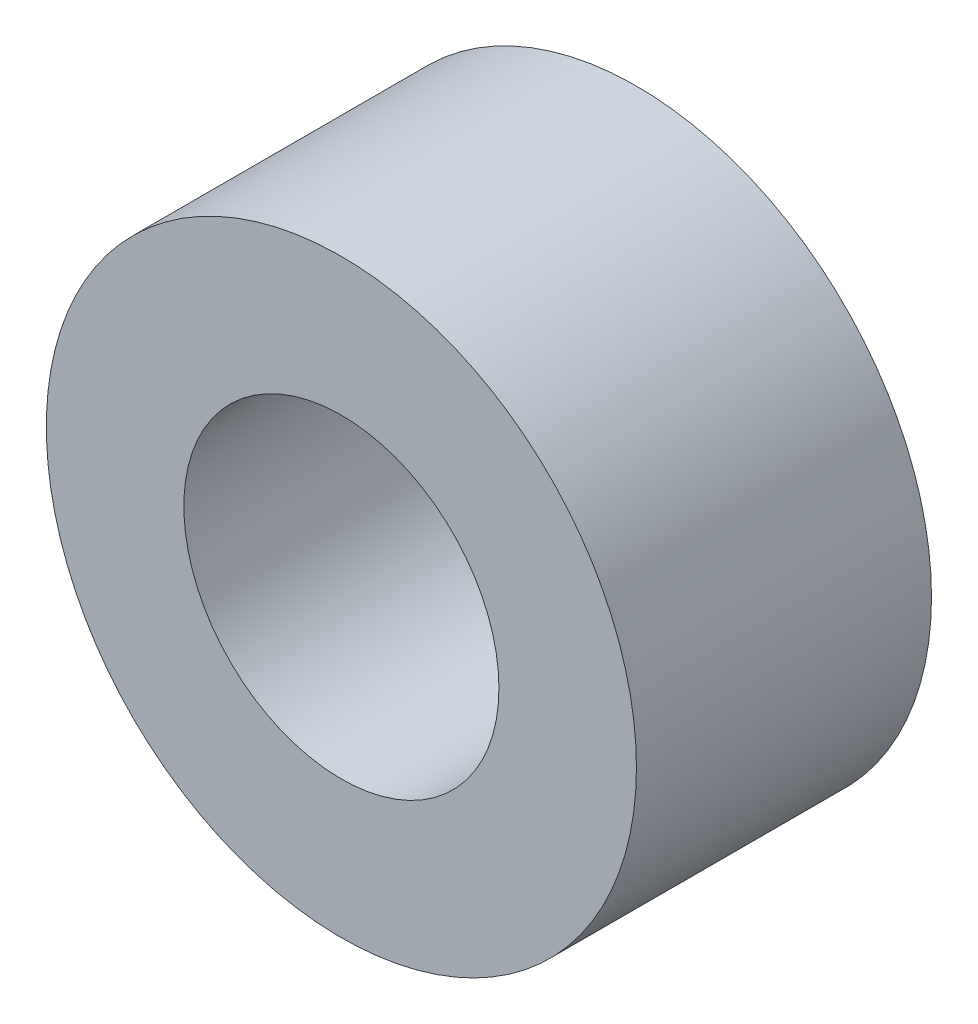
ISO-10303-21;
HEADER;
FILE_DESCRIPTION(('STEP AP214'),'2;1');
FILE_NAME('part.step','',(''),(''),'','','');
FILE_SCHEMA(('AUTOMOTIVE_DESIGN { 1 0 10303 214 1 1 1 1 }'));
ENDSEC;
DATA;
#1=APPLICATION_CONTEXT('core data for automotive mechanical design processes');
#2=APPLICATION_PROTOCOL_DEFINITION('international standard','automotive_design',2000,#1);
#3=PRODUCT_CONTEXT('',#1,'mechanical');
#4=PRODUCT('Part','Part','',(#3));
#5=PRODUCT_RELATED_PRODUCT_CATEGORY('part','',(#4));
#6=PRODUCT_DEFINITION_FORMATION('','',#4);
#7=PRODUCT_DEFINITION_CONTEXT('part definition',#1,'design');
#8=PRODUCT_DEFINITION('design','',#6,#7);
#9=PRODUCT_DEFINITION_SHAPE('','',#8);
#10=(LENGTH_UNIT() NAMED_UNIT(*) SI_UNIT(.MILLI.,.METRE.));
#11=(NAMED_UNIT(*) PLANE_ANGLE_UNIT() SI_UNIT($,.RADIAN.));
#12=(NAMED_UNIT(*) SI_UNIT($,.STERADIAN.) SOLID_ANGLE_UNIT());
#13=UNCERTAINTY_MEASURE_WITH_UNIT(LENGTH_MEASURE(1.E-05),#10,'distance_accuracy_value','');
#14=(GEOMETRIC_REPRESENTATION_CONTEXT(3) GLOBAL_UNCERTAINTY_ASSIGNED_CONTEXT((#13)) GLOBAL_UNIT_ASSIGNED_CONTEXT((#10,
#11,#12)) REPRESENTATION_CONTEXT('',''));
#15=CARTESIAN_POINT('',(0.,0.,0.));
#16=DIRECTION('',(0.,0.,1.));
#17=DIRECTION('',(1.,0.,0.));
#18=AXIS2_PLACEMENT_3D('',#15,#16,#17);
#19=CARTESIAN_POINT('',(0.,0.,6.35));
#20=DIRECTION('',(0.,0.,1.));
#21=DIRECTION('',(1.,0.,0.));
#22=AXIS2_PLACEMENT_3D('',#19,#20,#21);
#23=PLANE('',#22);
#24=CARTESIAN_POINT('',(0.,0.,6.35));
#25=DIRECTION('',(0.,0.,1.));
#26=DIRECTION('',(1.,0.,0.));
#27=AXIS2_PLACEMENT_3D('',#24,#25,#26);
#28=CIRCLE('',#27,6.35);
#29=CARTESIAN_POINT('',(6.35,0.,6.35));
#30=VERTEX_POINT('',#29);
#31=EDGE_CURVE('E10',#30,#30,#28,.T.);
#32=ORIENTED_EDGE('',*,*,#31,.T.);
#33=EDGE_LOOP('',(#32));
#34=FACE_BOUND('',#33,.T.);
#35=CARTESIAN_POINT('',(0.,0.,6.35));
#36=DIRECTION('',(0.,0.,1.));
#37=DIRECTION('',(1.,0.,0.));
#38=AXIS2_PLACEMENT_3D('',#35,#36,#37);
#39=CIRCLE('',#38,3.3909);
#40=CARTESIAN_POINT('',(3.3909,0.,6.35));
#41=VERTEX_POINT('',#40);
#42=EDGE_CURVE('E50',#41,#41,#39,.T.);
#43=ORIENTED_EDGE('',*,*,#42,.F.);
#44=EDGE_LOOP('',(#43));
#45=FACE_BOUND('',#44,.T.);
#46=ADVANCED_FACE('F39',(#34,#45),#23,.T.);
#47=CARTESIAN_POINT('',(0.,0.,0.));
#48=DIRECTION('',(0.,0.,1.));
#49=DIRECTION('',(1.,0.,0.));
#50=AXIS2_PLACEMENT_3D('',#47,#48,#49);
#51=PLANE('',#50);
#52=CARTESIAN_POINT('',(0.,0.,0.));
#53=DIRECTION('',(0.,0.,1.));
#54=DIRECTION('',(1.,0.,0.));
#55=AXIS2_PLACEMENT_3D('',#52,#53,#54);
#56=CIRCLE('',#55,6.35);
#57=CARTESIAN_POINT('',(6.35,0.,0.));
#58=VERTEX_POINT('',#57);
#59=EDGE_CURVE('E43',#58,#58,#56,.T.);
#60=ORIENTED_EDGE('',*,*,#59,.F.);
#61=EDGE_LOOP('',(#60));
#62=FACE_BOUND('',#61,.T.);
#63=CARTESIAN_POINT('',(0.,0.,0.));
#64=DIRECTION('',(0.,0.,1.));
#65=DIRECTION('',(1.,0.,0.));
#66=AXIS2_PLACEMENT_3D('',#63,#64,#65);
#67=CIRCLE('',#66,3.3909);
#68=CARTESIAN_POINT('',(3.3909,0.,0.));
#69=VERTEX_POINT('',#68);
#70=EDGE_CURVE('E52',#69,#69,#67,.T.);
#71=ORIENTED_EDGE('',*,*,#70,.T.);
#72=EDGE_LOOP('',(#71));
#73=FACE_BOUND('',#72,.T.);
#74=ADVANCED_FACE('F62',(#62,#73),#51,.F.);
#75=CARTESIAN_POINT('',(0.,0.,6.35));
#76=DIRECTION('',(0.,0.,-1.));
#77=DIRECTION('',(-1.,0.,0.));
#78=AXIS2_PLACEMENT_3D('',#75,#76,#77);
#79=CYLINDRICAL_SURFACE('',#78,6.35);
#80=ORIENTED_EDGE('',*,*,#31,.F.);
#81=EDGE_LOOP('',(#80));
#82=FACE_BOUND('',#81,.T.);
#83=ORIENTED_EDGE('',*,*,#59,.T.);
#84=EDGE_LOOP('',(#83));
#85=FACE_BOUND('',#84,.T.);
#86=ADVANCED_FACE('F41',(#82,#85),#79,.T.);
#87=CARTESIAN_POINT('',(0.,0.,6.35));
#88=DIRECTION('',(0.,0.,-1.));
#89=DIRECTION('',(-1.,0.,0.));
#90=AXIS2_PLACEMENT_3D('',#87,#88,#89);
#91=CYLINDRICAL_SURFACE('',#90,3.3909);
#92=ORIENTED_EDGE('',*,*,#42,.T.);
#93=EDGE_LOOP('',(#92));
#94=FACE_BOUND('',#93,.T.);
#95=ORIENTED_EDGE('',*,*,#70,.F.);
#96=EDGE_LOOP('',(#95));
#97=FACE_BOUND('',#96,.T.);
#98=ADVANCED_FACE('F58',(#94,#97),#91,.F.);
#99=CLOSED_SHELL('',(#46,#74,#86,#98));
#100=MANIFOLD_SOLID_BREP('B2',#99);
#101=ADVANCED_BREP_SHAPE_REPRESENTATION('',(#18,#100),#14);
#102=SHAPE_DEFINITION_REPRESENTATION(#9,#101);
ENDSEC;
END-ISO-10303-21;
